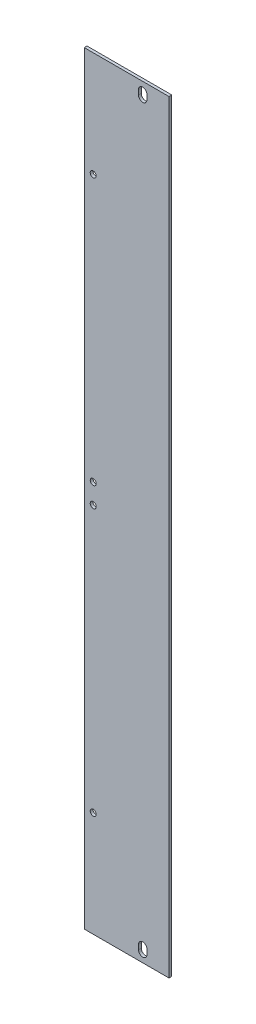
ISO-10303-21;
HEADER;
FILE_DESCRIPTION(('STEP AP214'),'2;1');
FILE_NAME('part.step','',(''),(''),'','','');
FILE_SCHEMA(('AUTOMOTIVE_DESIGN { 1 0 10303 214 1 1 1 1 }'));
ENDSEC;
DATA;
#1=APPLICATION_CONTEXT('core data for automotive mechanical design processes');
#2=APPLICATION_PROTOCOL_DEFINITION('international standard','automotive_design',2000,#1);
#3=PRODUCT_CONTEXT('',#1,'mechanical');
#4=PRODUCT('Part','Part','',(#3));
#5=PRODUCT_RELATED_PRODUCT_CATEGORY('part','',(#4));
#6=PRODUCT_DEFINITION_FORMATION('','',#4);
#7=PRODUCT_DEFINITION_CONTEXT('part definition',#1,'design');
#8=PRODUCT_DEFINITION('design','',#6,#7);
#9=PRODUCT_DEFINITION_SHAPE('','',#8);
#10=(LENGTH_UNIT() NAMED_UNIT(*) SI_UNIT(.MILLI.,.METRE.));
#11=(NAMED_UNIT(*) PLANE_ANGLE_UNIT() SI_UNIT($,.RADIAN.));
#12=(NAMED_UNIT(*) SI_UNIT($,.STERADIAN.) SOLID_ANGLE_UNIT());
#13=UNCERTAINTY_MEASURE_WITH_UNIT(LENGTH_MEASURE(1.E-05),#10,'distance_accuracy_value','');
#14=(GEOMETRIC_REPRESENTATION_CONTEXT(3) GLOBAL_UNCERTAINTY_ASSIGNED_CONTEXT((#13)) GLOBAL_UNIT_ASSIGNED_CONTEXT((#10,
#11,#12)) REPRESENTATION_CONTEXT('',''));
#15=CARTESIAN_POINT('',(0.,0.,0.));
#16=DIRECTION('',(0.,0.,1.));
#17=DIRECTION('',(1.,0.,0.));
#18=AXIS2_PLACEMENT_3D('',#15,#16,#17);
#19=CARTESIAN_POINT('',(35.1103295335567,368.3,-2.66699999999995));
#20=DIRECTION('',(0.,1.,0.));
#21=DIRECTION('',(1.,0.,0.));
#22=AXIS2_PLACEMENT_3D('',#19,#20,#21);
#23=PLANE('',#22);
#24=DIRECTION('',(-1.,0.,0.));
#25=VECTOR('',#24,1.);
#26=CARTESIAN_POINT('',(35.1103295335567,368.3,-2.66699999999995));
#27=LINE('',#26,#25);
#28=CARTESIAN_POINT('',(45.1433295335567,368.3,-2.66700000000002));
#29=VERTEX_POINT('',#28);
#30=CARTESIAN_POINT('',(-36.576,368.3,-2.667));
#31=VERTEX_POINT('',#30);
#32=EDGE_CURVE('E108',#29,#31,#27,.T.);
#33=ORIENTED_EDGE('',*,*,#32,.T.);
#34=DIRECTION('',(0.,0.,1.));
#35=VECTOR('',#34,1.);
#36=CARTESIAN_POINT('',(-36.576,368.3,-2.667));
#37=LINE('',#36,#35);
#38=CARTESIAN_POINT('',(-36.576,368.3,0.));
#39=VERTEX_POINT('',#38);
#40=EDGE_CURVE('E176',#31,#39,#37,.T.);
#41=ORIENTED_EDGE('',*,*,#40,.T.);
#42=DIRECTION('',(1.,0.,0.));
#43=VECTOR('',#42,1.);
#44=CARTESIAN_POINT('',(35.1103295335566,368.3,0.));
#45=LINE('',#44,#43);
#46=CARTESIAN_POINT('',(45.1433295335567,368.3,0.));
#47=VERTEX_POINT('',#46);
#48=EDGE_CURVE('E187',#47,#39,#45,.F.);
#49=ORIENTED_EDGE('',*,*,#48,.F.);
#50=DIRECTION('',(0.,0.,1.));
#51=VECTOR('',#50,1.);
#52=CARTESIAN_POINT('',(45.1433295335567,368.3,-2.66700000000002));
#53=LINE('',#52,#51);
#54=EDGE_CURVE('E13',#29,#47,#53,.T.);
#55=ORIENTED_EDGE('',*,*,#54,.F.);
#56=EDGE_LOOP('',(#33,#41,#49,#55));
#57=FACE_BOUND('',#56,.T.);
#58=ADVANCED_FACE('F69',(#57),#23,.T.);
#59=CARTESIAN_POINT('',(45.1433295335568,-368.3,-2.66700000000007));
#60=DIRECTION('',(0.,-1.,0.));
#61=DIRECTION('',(-1.,0.,0.));
#62=AXIS2_PLACEMENT_3D('',#59,#60,#61);
#63=PLANE('',#62);
#64=DIRECTION('',(-1.,0.,0.));
#65=VECTOR('',#64,1.);
#66=CARTESIAN_POINT('',(35.1103295335566,-368.3,0.));
#67=LINE('',#66,#65);
#68=CARTESIAN_POINT('',(-36.576,-368.3,0.));
#69=VERTEX_POINT('',#68);
#70=CARTESIAN_POINT('',(45.1433295335568,-368.3,0.));
#71=VERTEX_POINT('',#70);
#72=EDGE_CURVE('E73',#69,#71,#67,.F.);
#73=ORIENTED_EDGE('',*,*,#72,.F.);
#74=DIRECTION('',(0.,0.,1.));
#75=VECTOR('',#74,1.);
#76=CARTESIAN_POINT('',(-36.576,-368.3,-2.667));
#77=LINE('',#76,#75);
#78=CARTESIAN_POINT('',(-36.576,-368.3,-2.667));
#79=VERTEX_POINT('',#78);
#80=EDGE_CURVE('E171',#79,#69,#77,.T.);
#81=ORIENTED_EDGE('',*,*,#80,.F.);
#82=DIRECTION('',(1.,0.,0.));
#83=VECTOR('',#82,1.);
#84=CARTESIAN_POINT('',(45.1433295335568,-368.3,-2.66700000000007));
#85=LINE('',#84,#83);
#86=CARTESIAN_POINT('',(45.1433295335568,-368.3,-2.66700000000007));
#87=VERTEX_POINT('',#86);
#88=EDGE_CURVE('E320',#79,#87,#85,.T.);
#89=ORIENTED_EDGE('',*,*,#88,.T.);
#90=DIRECTION('',(0.,0.,1.));
#91=VECTOR('',#90,1.);
#92=CARTESIAN_POINT('',(45.1433295335568,-368.3,-2.66700000000007));
#93=LINE('',#92,#91);
#94=EDGE_CURVE('E80',#87,#71,#93,.T.);
#95=ORIENTED_EDGE('',*,*,#94,.T.);
#96=EDGE_LOOP('',(#73,#81,#89,#95));
#97=FACE_BOUND('',#96,.T.);
#98=ADVANCED_FACE('F170',(#97),#63,.T.);
#99=CARTESIAN_POINT('',(35.1103295335566,0.,-2.66699999999997));
#100=DIRECTION('',(0.,0.,-1.));
#101=DIRECTION('',(-1.,0.,0.));
#102=AXIS2_PLACEMENT_3D('',#99,#100,#101);
#103=PLANE('',#102);
#104=ORIENTED_EDGE('',*,*,#88,.F.);
#105=DIRECTION('',(0.,-1.,0.));
#106=VECTOR('',#105,1.);
#107=CARTESIAN_POINT('',(-36.576,-368.3,-2.667));
#108=LINE('',#107,#106);
#109=EDGE_CURVE('E182',#31,#79,#108,.T.);
#110=ORIENTED_EDGE('',*,*,#109,.F.);
#111=ORIENTED_EDGE('',*,*,#32,.F.);
#112=DIRECTION('',(0.,1.,0.));
#113=VECTOR('',#112,1.);
#114=CARTESIAN_POINT('',(45.1433295335567,368.3,-2.66700000000002));
#115=LINE('',#114,#113);
#116=EDGE_CURVE('E317',#87,#29,#115,.T.);
#117=ORIENTED_EDGE('',*,*,#116,.F.);
#118=EDGE_LOOP('',(#104,#110,#111,#117));
#119=FACE_BOUND('',#118,.T.);
#120=CARTESIAN_POINT('',(19.812,359.41,-2.66700000000002));
#121=DIRECTION('',(0.,0.,1.));
#122=DIRECTION('',(1.,0.,0.));
#123=AXIS2_PLACEMENT_3D('',#120,#121,#122);
#124=CIRCLE('',#123,4.064);
#125=CARTESIAN_POINT('',(23.876,359.41,-2.66700000000002));
#126=VERTEX_POINT('',#125);
#127=CARTESIAN_POINT('',(15.748,359.41,-2.66700000000002));
#128=VERTEX_POINT('',#127);
#129=EDGE_CURVE('E238',#126,#128,#124,.T.);
#130=ORIENTED_EDGE('',*,*,#129,.T.);
#131=DIRECTION('',(0.,-1.,0.));
#132=VECTOR('',#131,1.);
#133=CARTESIAN_POINT('',(15.748,359.41,-2.66700000000002));
#134=LINE('',#133,#132);
#135=CARTESIAN_POINT('',(15.748,354.838,-2.667));
#136=VERTEX_POINT('',#135);
#137=EDGE_CURVE('E234',#128,#136,#134,.T.);
#138=ORIENTED_EDGE('',*,*,#137,.T.);
#139=CARTESIAN_POINT('',(19.812,354.838,-2.66700000000002));
#140=DIRECTION('',(0.,0.,1.));
#141=DIRECTION('',(1.,0.,0.));
#142=AXIS2_PLACEMENT_3D('',#139,#140,#141);
#143=CIRCLE('',#142,4.064);
#144=CARTESIAN_POINT('',(23.876,354.838,-2.66700000000002));
#145=VERTEX_POINT('',#144);
#146=EDGE_CURVE('E230',#136,#145,#143,.T.);
#147=ORIENTED_EDGE('',*,*,#146,.T.);
#148=DIRECTION('',(0.,1.,0.));
#149=VECTOR('',#148,1.);
#150=CARTESIAN_POINT('',(23.876,359.41,-2.66700000000002));
#151=LINE('',#150,#149);
#152=EDGE_CURVE('E226',#145,#126,#151,.T.);
#153=ORIENTED_EDGE('',*,*,#152,.T.);
#154=EDGE_LOOP('',(#130,#138,#147,#153));
#155=FACE_BOUND('',#154,.T.);
#156=CARTESIAN_POINT('',(-27.94,266.7,-2.66700000000002));
#157=DIRECTION('',(0.,0.,1.));
#158=DIRECTION('',(1.,0.,0.));
#159=AXIS2_PLACEMENT_3D('',#156,#157,#158);
#160=CIRCLE('',#159,2.8956);
#161=CARTESIAN_POINT('',(-25.0444,266.7,-2.66700000000002));
#162=VERTEX_POINT('',#161);
#163=EDGE_CURVE('E222',#162,#162,#160,.T.);
#164=ORIENTED_EDGE('',*,*,#163,.T.);
#165=EDGE_LOOP('',(#164));
#166=FACE_BOUND('',#165,.T.);
#167=CARTESIAN_POINT('',(-27.94,9.65199999999999,-2.66700000000002));
#168=DIRECTION('',(0.,0.,1.));
#169=DIRECTION('',(1.,0.,0.));
#170=AXIS2_PLACEMENT_3D('',#167,#168,#169);
#171=CIRCLE('',#170,2.8956);
#172=CARTESIAN_POINT('',(-25.0444,9.65199999999999,-2.66700000000002));
#173=VERTEX_POINT('',#172);
#174=EDGE_CURVE('E218',#173,#173,#171,.T.);
#175=ORIENTED_EDGE('',*,*,#174,.T.);
#176=EDGE_LOOP('',(#175));
#177=FACE_BOUND('',#176,.T.);
#178=CARTESIAN_POINT('',(-27.94,-9.6520000000001,-2.66700000000002));
#179=DIRECTION('',(0.,0.,1.));
#180=DIRECTION('',(1.,0.,0.));
#181=AXIS2_PLACEMENT_3D('',#178,#179,#180);
#182=CIRCLE('',#181,2.8956);
#183=CARTESIAN_POINT('',(-25.0444,-9.6520000000001,-2.66700000000002));
#184=VERTEX_POINT('',#183);
#185=EDGE_CURVE('E214',#184,#184,#182,.T.);
#186=ORIENTED_EDGE('',*,*,#185,.T.);
#187=EDGE_LOOP('',(#186));
#188=FACE_BOUND('',#187,.T.);
#189=CARTESIAN_POINT('',(-27.94,-266.7,-2.66700000000002));
#190=DIRECTION('',(0.,0.,1.));
#191=DIRECTION('',(1.,0.,0.));
#192=AXIS2_PLACEMENT_3D('',#189,#190,#191);
#193=CIRCLE('',#192,2.8956);
#194=CARTESIAN_POINT('',(-25.0444,-266.7,-2.66700000000002));
#195=VERTEX_POINT('',#194);
#196=EDGE_CURVE('E210',#195,#195,#193,.T.);
#197=ORIENTED_EDGE('',*,*,#196,.T.);
#198=EDGE_LOOP('',(#197));
#199=FACE_BOUND('',#198,.T.);
#200=CARTESIAN_POINT('',(19.812,-359.41,-2.66700000000002));
#201=DIRECTION('',(0.,0.,1.));
#202=DIRECTION('',(1.,0.,0.));
#203=AXIS2_PLACEMENT_3D('',#200,#201,#202);
#204=CIRCLE('',#203,4.064);
#205=CARTESIAN_POINT('',(15.748,-359.41,-2.66700000000002));
#206=VERTEX_POINT('',#205);
#207=CARTESIAN_POINT('',(23.876,-359.41,-2.66700000000002));
#208=VERTEX_POINT('',#207);
#209=EDGE_CURVE('E206',#206,#208,#204,.T.);
#210=ORIENTED_EDGE('',*,*,#209,.T.);
#211=DIRECTION('',(0.,1.,0.));
#212=VECTOR('',#211,1.);
#213=CARTESIAN_POINT('',(23.876,-359.41,-2.66700000000002));
#214=LINE('',#213,#212);
#215=CARTESIAN_POINT('',(23.876,-354.838,-2.667));
#216=VERTEX_POINT('',#215);
#217=EDGE_CURVE('E202',#208,#216,#214,.T.);
#218=ORIENTED_EDGE('',*,*,#217,.T.);
#219=CARTESIAN_POINT('',(19.812,-354.838,-2.66700000000002));
#220=DIRECTION('',(0.,0.,1.));
#221=DIRECTION('',(1.,0.,0.));
#222=AXIS2_PLACEMENT_3D('',#219,#220,#221);
#223=CIRCLE('',#222,4.064);
#224=CARTESIAN_POINT('',(15.748,-354.838,-2.66700000000002));
#225=VERTEX_POINT('',#224);
#226=EDGE_CURVE('E196',#216,#225,#223,.T.);
#227=ORIENTED_EDGE('',*,*,#226,.T.);
#228=DIRECTION('',(0.,-1.,0.));
#229=VECTOR('',#228,1.);
#230=CARTESIAN_POINT('',(15.748,-359.41,-2.66700000000002));
#231=LINE('',#230,#229);
#232=EDGE_CURVE('E189',#225,#206,#231,.T.);
#233=ORIENTED_EDGE('',*,*,#232,.T.);
#234=EDGE_LOOP('',(#210,#218,#227,#233));
#235=FACE_BOUND('',#234,.T.);
#236=ADVANCED_FACE('F327',(#119,#155,#166,#177,#188,#199,#235),#103,.T.);
#237=CARTESIAN_POINT('',(0.,0.,0.));
#238=DIRECTION('',(0.,0.,-1.));
#239=DIRECTION('',(-1.,0.,0.));
#240=AXIS2_PLACEMENT_3D('',#237,#238,#239);
#241=PLANE('',#240);
#242=ORIENTED_EDGE('',*,*,#48,.T.);
#243=DIRECTION('',(0.,-1.,0.));
#244=VECTOR('',#243,1.);
#245=CARTESIAN_POINT('',(-36.576,-368.3,0.));
#246=LINE('',#245,#244);
#247=EDGE_CURVE('E180',#39,#69,#246,.T.);
#248=ORIENTED_EDGE('',*,*,#247,.T.);
#249=ORIENTED_EDGE('',*,*,#72,.T.);
#250=DIRECTION('',(0.,-1.,0.));
#251=VECTOR('',#250,1.);
#252=CARTESIAN_POINT('',(45.1433295335567,0.,0.));
#253=LINE('',#252,#251);
#254=EDGE_CURVE('E175',#71,#47,#253,.F.);
#255=ORIENTED_EDGE('',*,*,#254,.T.);
#256=EDGE_LOOP('',(#242,#248,#249,#255));
#257=FACE_BOUND('',#256,.T.);
#258=DIRECTION('',(0.,-1.,0.));
#259=VECTOR('',#258,1.);
#260=CARTESIAN_POINT('',(15.748,359.41,0.));
#261=LINE('',#260,#259);
#262=CARTESIAN_POINT('',(15.748,359.41,0.));
#263=VERTEX_POINT('',#262);
#264=CARTESIAN_POINT('',(15.748,354.838,0.));
#265=VERTEX_POINT('',#264);
#266=EDGE_CURVE('E252',#263,#265,#261,.T.);
#267=ORIENTED_EDGE('',*,*,#266,.F.);
#268=CARTESIAN_POINT('',(19.812,359.41,0.));
#269=DIRECTION('',(0.,0.,1.));
#270=DIRECTION('',(1.,0.,0.));
#271=AXIS2_PLACEMENT_3D('',#268,#269,#270);
#272=CIRCLE('',#271,4.064);
#273=CARTESIAN_POINT('',(23.876,359.41,0.));
#274=VERTEX_POINT('',#273);
#275=EDGE_CURVE('E245',#274,#263,#272,.T.);
#276=ORIENTED_EDGE('',*,*,#275,.F.);
#277=DIRECTION('',(0.,1.,0.));
#278=VECTOR('',#277,1.);
#279=CARTESIAN_POINT('',(23.876,359.41,0.));
#280=LINE('',#279,#278);
#281=CARTESIAN_POINT('',(23.876,354.838,0.));
#282=VERTEX_POINT('',#281);
#283=EDGE_CURVE('E266',#282,#274,#280,.T.);
#284=ORIENTED_EDGE('',*,*,#283,.F.);
#285=CARTESIAN_POINT('',(19.812,354.838,0.));
#286=DIRECTION('',(0.,0.,1.));
#287=DIRECTION('',(1.,0.,0.));
#288=AXIS2_PLACEMENT_3D('',#285,#286,#287);
#289=CIRCLE('',#288,4.064);
#290=EDGE_CURVE('E259',#265,#282,#289,.T.);
#291=ORIENTED_EDGE('',*,*,#290,.F.);
#292=EDGE_LOOP('',(#267,#276,#284,#291));
#293=FACE_BOUND('',#292,.T.);
#294=CARTESIAN_POINT('',(-27.94,266.7,0.));
#295=DIRECTION('',(0.,0.,1.));
#296=DIRECTION('',(1.,0.,0.));
#297=AXIS2_PLACEMENT_3D('',#294,#295,#296);
#298=CIRCLE('',#297,2.8956);
#299=CARTESIAN_POINT('',(-25.0444,266.7,0.));
#300=VERTEX_POINT('',#299);
#301=EDGE_CURVE('E270',#300,#300,#298,.T.);
#302=ORIENTED_EDGE('',*,*,#301,.F.);
#303=EDGE_LOOP('',(#302));
#304=FACE_BOUND('',#303,.T.);
#305=CARTESIAN_POINT('',(-27.94,9.65199999999999,0.));
#306=DIRECTION('',(0.,0.,1.));
#307=DIRECTION('',(1.,0.,0.));
#308=AXIS2_PLACEMENT_3D('',#305,#306,#307);
#309=CIRCLE('',#308,2.8956);
#310=CARTESIAN_POINT('',(-25.0444,9.65199999999999,0.));
#311=VERTEX_POINT('',#310);
#312=EDGE_CURVE('E274',#311,#311,#309,.T.);
#313=ORIENTED_EDGE('',*,*,#312,.F.);
#314=EDGE_LOOP('',(#313));
#315=FACE_BOUND('',#314,.T.);
#316=CARTESIAN_POINT('',(-27.94,-9.6520000000001,0.));
#317=DIRECTION('',(0.,0.,1.));
#318=DIRECTION('',(1.,0.,0.));
#319=AXIS2_PLACEMENT_3D('',#316,#317,#318);
#320=CIRCLE('',#319,2.8956);
#321=CARTESIAN_POINT('',(-25.0444,-9.6520000000001,0.));
#322=VERTEX_POINT('',#321);
#323=EDGE_CURVE('E278',#322,#322,#320,.T.);
#324=ORIENTED_EDGE('',*,*,#323,.F.);
#325=EDGE_LOOP('',(#324));
#326=FACE_BOUND('',#325,.T.);
#327=CARTESIAN_POINT('',(-27.94,-266.7,0.));
#328=DIRECTION('',(0.,0.,1.));
#329=DIRECTION('',(1.,0.,0.));
#330=AXIS2_PLACEMENT_3D('',#327,#328,#329);
#331=CIRCLE('',#330,2.8956);
#332=CARTESIAN_POINT('',(-25.0444,-266.7,0.));
#333=VERTEX_POINT('',#332);
#334=EDGE_CURVE('E282',#333,#333,#331,.T.);
#335=ORIENTED_EDGE('',*,*,#334,.F.);
#336=EDGE_LOOP('',(#335));
#337=FACE_BOUND('',#336,.T.);
#338=DIRECTION('',(0.,1.,0.));
#339=VECTOR('',#338,1.);
#340=CARTESIAN_POINT('',(23.876,-359.41,0.));
#341=LINE('',#340,#339);
#342=CARTESIAN_POINT('',(23.876,-359.41,0.));
#343=VERTEX_POINT('',#342);
#344=CARTESIAN_POINT('',(23.876,-354.838,0.));
#345=VERTEX_POINT('',#344);
#346=EDGE_CURVE('E295',#343,#345,#341,.T.);
#347=ORIENTED_EDGE('',*,*,#346,.F.);
#348=CARTESIAN_POINT('',(19.812,-359.41,0.));
#349=DIRECTION('',(0.,0.,1.));
#350=DIRECTION('',(1.,0.,0.));
#351=AXIS2_PLACEMENT_3D('',#348,#349,#350);
#352=CIRCLE('',#351,4.064);
#353=CARTESIAN_POINT('',(15.748,-359.41,0.));
#354=VERTEX_POINT('',#353);
#355=EDGE_CURVE('E288',#354,#343,#352,.T.);
#356=ORIENTED_EDGE('',*,*,#355,.F.);
#357=DIRECTION('',(0.,-1.,0.));
#358=VECTOR('',#357,1.);
#359=CARTESIAN_POINT('',(15.748,-359.41,0.));
#360=LINE('',#359,#358);
#361=CARTESIAN_POINT('',(15.748,-354.838,0.));
#362=VERTEX_POINT('',#361);
#363=EDGE_CURVE('E184',#362,#354,#360,.T.);
#364=ORIENTED_EDGE('',*,*,#363,.F.);
#365=CARTESIAN_POINT('',(19.812,-354.838,0.));
#366=DIRECTION('',(0.,0.,1.));
#367=DIRECTION('',(1.,0.,0.));
#368=AXIS2_PLACEMENT_3D('',#365,#366,#367);
#369=CIRCLE('',#368,4.064);
#370=EDGE_CURVE('E302',#345,#362,#369,.T.);
#371=ORIENTED_EDGE('',*,*,#370,.F.);
#372=EDGE_LOOP('',(#347,#356,#364,#371));
#373=FACE_BOUND('',#372,.T.);
#374=ADVANCED_FACE('F71',(#257,#293,#304,#315,#326,#337,#373),#241,.F.);
#375=CARTESIAN_POINT('',(45.1433295335567,368.3,-2.66700000000002));
#376=DIRECTION('',(1.,0.,0.));
#377=DIRECTION('',(0.,0.,-1.));
#378=AXIS2_PLACEMENT_3D('',#375,#376,#377);
#379=PLANE('',#378);
#380=ORIENTED_EDGE('',*,*,#254,.F.);
#381=ORIENTED_EDGE('',*,*,#94,.F.);
#382=ORIENTED_EDGE('',*,*,#116,.T.);
#383=ORIENTED_EDGE('',*,*,#54,.T.);
#384=EDGE_LOOP('',(#380,#381,#382,#383));
#385=FACE_BOUND('',#384,.T.);
#386=ADVANCED_FACE('F330',(#385),#379,.T.);
#387=CARTESIAN_POINT('',(-36.576,-368.3,-2.667));
#388=DIRECTION('',(-1.,0.,0.));
#389=DIRECTION('',(0.,0.,1.));
#390=AXIS2_PLACEMENT_3D('',#387,#388,#389);
#391=PLANE('',#390);
#392=ORIENTED_EDGE('',*,*,#247,.F.);
#393=ORIENTED_EDGE('',*,*,#40,.F.);
#394=ORIENTED_EDGE('',*,*,#109,.T.);
#395=ORIENTED_EDGE('',*,*,#80,.T.);
#396=EDGE_LOOP('',(#392,#393,#394,#395));
#397=FACE_BOUND('',#396,.T.);
#398=ADVANCED_FACE('F179',(#397),#391,.T.);
#399=CARTESIAN_POINT('',(15.748,-359.41,-2.66700000000002));
#400=DIRECTION('',(-1.,0.,0.));
#401=DIRECTION('',(0.,0.,1.));
#402=AXIS2_PLACEMENT_3D('',#399,#400,#401);
#403=PLANE('',#402);
#404=ORIENTED_EDGE('',*,*,#363,.T.);
#405=DIRECTION('',(0.,0.,1.));
#406=VECTOR('',#405,1.);
#407=CARTESIAN_POINT('',(15.748,-359.41,-2.66700000000002));
#408=LINE('',#407,#406);
#409=EDGE_CURVE('E165',#206,#354,#408,.T.);
#410=ORIENTED_EDGE('',*,*,#409,.F.);
#411=ORIENTED_EDGE('',*,*,#232,.F.);
#412=DIRECTION('',(0.,0.,1.));
#413=VECTOR('',#412,1.);
#414=CARTESIAN_POINT('',(15.748,-354.838,-2.66700000000002));
#415=LINE('',#414,#413);
#416=EDGE_CURVE('E306',#225,#362,#415,.T.);
#417=ORIENTED_EDGE('',*,*,#416,.T.);
#418=EDGE_LOOP('',(#404,#410,#411,#417));
#419=FACE_BOUND('',#418,.T.);
#420=ADVANCED_FACE('F337',(#419),#403,.F.);
#421=CARTESIAN_POINT('',(19.812,-354.838,-2.66700000000002));
#422=DIRECTION('',(0.,0.,1.));
#423=DIRECTION('',(1.,0.,0.));
#424=AXIS2_PLACEMENT_3D('',#421,#422,#423);
#425=CYLINDRICAL_SURFACE('',#424,4.064);
#426=ORIENTED_EDGE('',*,*,#370,.T.);
#427=ORIENTED_EDGE('',*,*,#416,.F.);
#428=ORIENTED_EDGE('',*,*,#226,.F.);
#429=DIRECTION('',(0.,0.,1.));
#430=VECTOR('',#429,1.);
#431=CARTESIAN_POINT('',(23.876,-354.838,-2.66700000000002));
#432=LINE('',#431,#430);
#433=EDGE_CURVE('E299',#216,#345,#432,.T.);
#434=ORIENTED_EDGE('',*,*,#433,.T.);
#435=EDGE_LOOP('',(#426,#427,#428,#434));
#436=FACE_BOUND('',#435,.T.);
#437=ADVANCED_FACE('F386',(#436),#425,.F.);
#438=CARTESIAN_POINT('',(23.876,-359.41,-2.66700000000002));
#439=DIRECTION('',(1.,0.,0.));
#440=DIRECTION('',(0.,0.,-1.));
#441=AXIS2_PLACEMENT_3D('',#438,#439,#440);
#442=PLANE('',#441);
#443=ORIENTED_EDGE('',*,*,#346,.T.);
#444=ORIENTED_EDGE('',*,*,#433,.F.);
#445=ORIENTED_EDGE('',*,*,#217,.F.);
#446=DIRECTION('',(0.,0.,1.));
#447=VECTOR('',#446,1.);
#448=CARTESIAN_POINT('',(23.876,-359.41,-2.66700000000002));
#449=LINE('',#448,#447);
#450=EDGE_CURVE('E291',#208,#343,#449,.T.);
#451=ORIENTED_EDGE('',*,*,#450,.T.);
#452=EDGE_LOOP('',(#443,#444,#445,#451));
#453=FACE_BOUND('',#452,.T.);
#454=ADVANCED_FACE('F382',(#453),#442,.F.);
#455=CARTESIAN_POINT('',(19.812,-359.41,-2.66700000000002));
#456=DIRECTION('',(0.,0.,1.));
#457=DIRECTION('',(1.,0.,0.));
#458=AXIS2_PLACEMENT_3D('',#455,#456,#457);
#459=CYLINDRICAL_SURFACE('',#458,4.064);
#460=ORIENTED_EDGE('',*,*,#355,.T.);
#461=ORIENTED_EDGE('',*,*,#450,.F.);
#462=ORIENTED_EDGE('',*,*,#209,.F.);
#463=ORIENTED_EDGE('',*,*,#409,.T.);
#464=EDGE_LOOP('',(#460,#461,#462,#463));
#465=FACE_BOUND('',#464,.T.);
#466=ADVANCED_FACE('F378',(#465),#459,.F.);
#467=CARTESIAN_POINT('',(-27.94,-266.7,-2.66700000000002));
#468=DIRECTION('',(0.,0.,1.));
#469=DIRECTION('',(1.,0.,0.));
#470=AXIS2_PLACEMENT_3D('',#467,#468,#469);
#471=CYLINDRICAL_SURFACE('',#470,2.8956);
#472=ORIENTED_EDGE('',*,*,#196,.F.);
#473=EDGE_LOOP('',(#472));
#474=FACE_BOUND('',#473,.T.);
#475=ORIENTED_EDGE('',*,*,#334,.T.);
#476=EDGE_LOOP('',(#475));
#477=FACE_BOUND('',#476,.T.);
#478=ADVANCED_FACE('F374',(#474,#477),#471,.F.);
#479=CARTESIAN_POINT('',(-27.94,-9.6520000000001,-2.66700000000002));
#480=DIRECTION('',(0.,0.,1.));
#481=DIRECTION('',(1.,0.,0.));
#482=AXIS2_PLACEMENT_3D('',#479,#480,#481);
#483=CYLINDRICAL_SURFACE('',#482,2.8956);
#484=ORIENTED_EDGE('',*,*,#185,.F.);
#485=EDGE_LOOP('',(#484));
#486=FACE_BOUND('',#485,.T.);
#487=ORIENTED_EDGE('',*,*,#323,.T.);
#488=EDGE_LOOP('',(#487));
#489=FACE_BOUND('',#488,.T.);
#490=ADVANCED_FACE('F370',(#486,#489),#483,.F.);
#491=CARTESIAN_POINT('',(-27.94,9.65199999999999,-2.66700000000002));
#492=DIRECTION('',(0.,0.,1.));
#493=DIRECTION('',(1.,0.,0.));
#494=AXIS2_PLACEMENT_3D('',#491,#492,#493);
#495=CYLINDRICAL_SURFACE('',#494,2.8956);
#496=ORIENTED_EDGE('',*,*,#174,.F.);
#497=EDGE_LOOP('',(#496));
#498=FACE_BOUND('',#497,.T.);
#499=ORIENTED_EDGE('',*,*,#312,.T.);
#500=EDGE_LOOP('',(#499));
#501=FACE_BOUND('',#500,.T.);
#502=ADVANCED_FACE('F366',(#498,#501),#495,.F.);
#503=CARTESIAN_POINT('',(-27.94,266.7,-2.66700000000002));
#504=DIRECTION('',(0.,0.,1.));
#505=DIRECTION('',(1.,0.,0.));
#506=AXIS2_PLACEMENT_3D('',#503,#504,#505);
#507=CYLINDRICAL_SURFACE('',#506,2.8956);
#508=ORIENTED_EDGE('',*,*,#163,.F.);
#509=EDGE_LOOP('',(#508));
#510=FACE_BOUND('',#509,.T.);
#511=ORIENTED_EDGE('',*,*,#301,.T.);
#512=EDGE_LOOP('',(#511));
#513=FACE_BOUND('',#512,.T.);
#514=ADVANCED_FACE('F362',(#510,#513),#507,.F.);
#515=CARTESIAN_POINT('',(23.876,359.41,-2.66700000000002));
#516=DIRECTION('',(1.,0.,0.));
#517=DIRECTION('',(0.,0.,-1.));
#518=AXIS2_PLACEMENT_3D('',#515,#516,#517);
#519=PLANE('',#518);
#520=ORIENTED_EDGE('',*,*,#283,.T.);
#521=DIRECTION('',(0.,0.,1.));
#522=VECTOR('',#521,1.);
#523=CARTESIAN_POINT('',(23.876,359.41,-2.66700000000002));
#524=LINE('',#523,#522);
#525=EDGE_CURVE('E242',#126,#274,#524,.T.);
#526=ORIENTED_EDGE('',*,*,#525,.F.);
#527=ORIENTED_EDGE('',*,*,#152,.F.);
#528=DIRECTION('',(0.,0.,1.));
#529=VECTOR('',#528,1.);
#530=CARTESIAN_POINT('',(23.876,354.838,-2.66700000000002));
#531=LINE('',#530,#529);
#532=EDGE_CURVE('E263',#145,#282,#531,.T.);
#533=ORIENTED_EDGE('',*,*,#532,.T.);
#534=EDGE_LOOP('',(#520,#526,#527,#533));
#535=FACE_BOUND('',#534,.T.);
#536=ADVANCED_FACE('F358',(#535),#519,.F.);
#537=CARTESIAN_POINT('',(19.812,354.838,-2.66700000000002));
#538=DIRECTION('',(0.,0.,1.));
#539=DIRECTION('',(1.,0.,0.));
#540=AXIS2_PLACEMENT_3D('',#537,#538,#539);
#541=CYLINDRICAL_SURFACE('',#540,4.064);
#542=ORIENTED_EDGE('',*,*,#290,.T.);
#543=ORIENTED_EDGE('',*,*,#532,.F.);
#544=ORIENTED_EDGE('',*,*,#146,.F.);
#545=DIRECTION('',(0.,0.,1.));
#546=VECTOR('',#545,1.);
#547=CARTESIAN_POINT('',(15.748,354.838,-2.66700000000002));
#548=LINE('',#547,#546);
#549=EDGE_CURVE('E256',#136,#265,#548,.T.);
#550=ORIENTED_EDGE('',*,*,#549,.T.);
#551=EDGE_LOOP('',(#542,#543,#544,#550));
#552=FACE_BOUND('',#551,.T.);
#553=ADVANCED_FACE('F354',(#552),#541,.F.);
#554=CARTESIAN_POINT('',(15.748,359.41,-2.66700000000002));
#555=DIRECTION('',(-1.,0.,0.));
#556=DIRECTION('',(0.,0.,1.));
#557=AXIS2_PLACEMENT_3D('',#554,#555,#556);
#558=PLANE('',#557);
#559=ORIENTED_EDGE('',*,*,#266,.T.);
#560=ORIENTED_EDGE('',*,*,#549,.F.);
#561=ORIENTED_EDGE('',*,*,#137,.F.);
#562=DIRECTION('',(0.,0.,1.));
#563=VECTOR('',#562,1.);
#564=CARTESIAN_POINT('',(15.748,359.41,-2.66700000000002));
#565=LINE('',#564,#563);
#566=EDGE_CURVE('E248',#128,#263,#565,.T.);
#567=ORIENTED_EDGE('',*,*,#566,.T.);
#568=EDGE_LOOP('',(#559,#560,#561,#567));
#569=FACE_BOUND('',#568,.T.);
#570=ADVANCED_FACE('F350',(#569),#558,.F.);
#571=CARTESIAN_POINT('',(19.812,359.41,-2.66700000000002));
#572=DIRECTION('',(0.,0.,1.));
#573=DIRECTION('',(1.,0.,0.));
#574=AXIS2_PLACEMENT_3D('',#571,#572,#573);
#575=CYLINDRICAL_SURFACE('',#574,4.064);
#576=ORIENTED_EDGE('',*,*,#275,.T.);
#577=ORIENTED_EDGE('',*,*,#566,.F.);
#578=ORIENTED_EDGE('',*,*,#129,.F.);
#579=ORIENTED_EDGE('',*,*,#525,.T.);
#580=EDGE_LOOP('',(#576,#577,#578,#579));
#581=FACE_BOUND('',#580,.T.);
#582=ADVANCED_FACE('F347',(#581),#575,.F.);
#583=CLOSED_SHELL('',(#58,#98,#236,#374,#386,#398,#420,#437,#454,#466,#478,#490,#502,#514,#536,
#553,#570,#582));
#584=MANIFOLD_SOLID_BREP('B2',#583);
#585=ADVANCED_BREP_SHAPE_REPRESENTATION('',(#18,#584),#14);
#586=SHAPE_DEFINITION_REPRESENTATION(#9,#585);
ENDSEC;
END-ISO-10303-21;
